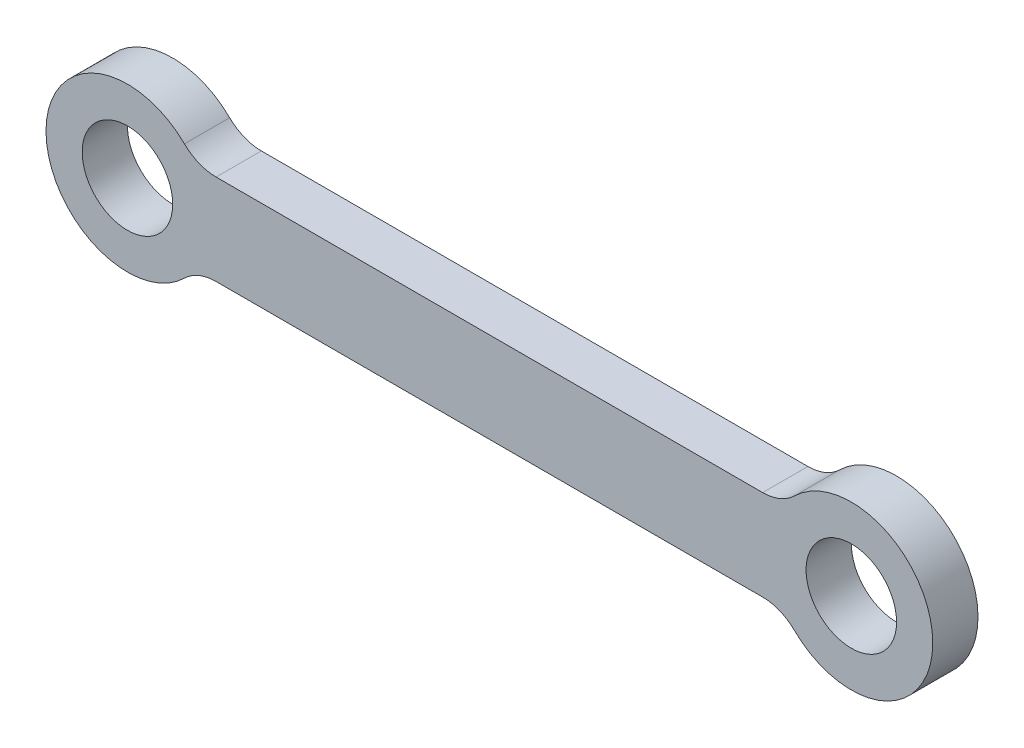
ISO-10303-21;
HEADER;
FILE_DESCRIPTION(('STEP AP214'),'2;1');
FILE_NAME('part.step','',(''),(''),'','','');
FILE_SCHEMA(('AUTOMOTIVE_DESIGN { 1 0 10303 214 1 1 1 1 }'));
ENDSEC;
DATA;
#1=APPLICATION_CONTEXT('core data for automotive mechanical design processes');
#2=APPLICATION_PROTOCOL_DEFINITION('international standard','automotive_design',2000,#1);
#3=PRODUCT_CONTEXT('',#1,'mechanical');
#4=PRODUCT('Part','Part','',(#3));
#5=PRODUCT_RELATED_PRODUCT_CATEGORY('part','',(#4));
#6=PRODUCT_DEFINITION_FORMATION('','',#4);
#7=PRODUCT_DEFINITION_CONTEXT('part definition',#1,'design');
#8=PRODUCT_DEFINITION('design','',#6,#7);
#9=PRODUCT_DEFINITION_SHAPE('','',#8);
#10=(LENGTH_UNIT() NAMED_UNIT(*) SI_UNIT(.MILLI.,.METRE.));
#11=(NAMED_UNIT(*) PLANE_ANGLE_UNIT() SI_UNIT($,.RADIAN.));
#12=(NAMED_UNIT(*) SI_UNIT($,.STERADIAN.) SOLID_ANGLE_UNIT());
#13=UNCERTAINTY_MEASURE_WITH_UNIT(LENGTH_MEASURE(1.E-05),#10,'distance_accuracy_value','');
#14=(GEOMETRIC_REPRESENTATION_CONTEXT(3) GLOBAL_UNCERTAINTY_ASSIGNED_CONTEXT((#13)) GLOBAL_UNIT_ASSIGNED_CONTEXT((#10,
#11,#12)) REPRESENTATION_CONTEXT('',''));
#15=CARTESIAN_POINT('',(0.,0.,0.));
#16=DIRECTION('',(0.,0.,1.));
#17=DIRECTION('',(1.,0.,0.));
#18=AXIS2_PLACEMENT_3D('',#15,#16,#17);
#19=CARTESIAN_POINT('',(70.2020410288673,10.,5.));
#20=DIRECTION('',(0.,0.,1.));
#21=DIRECTION('',(1.,0.,0.));
#22=AXIS2_PLACEMENT_3D('',#19,#20,#21);
#23=PLANE('',#22);
#24=CARTESIAN_POINT('',(0.,0.,5.));
#25=DIRECTION('',(0.,0.,1.));
#26=DIRECTION('',(1.,0.,0.));
#27=AXIS2_PLACEMENT_3D('',#24,#25,#26);
#28=CIRCLE('',#27,5.);
#29=CARTESIAN_POINT('',(5.,0.,5.));
#30=VERTEX_POINT('',#29);
#31=EDGE_CURVE('E134',#30,#30,#28,.T.);
#32=ORIENTED_EDGE('',*,*,#31,.F.);
#33=EDGE_LOOP('',(#32));
#34=FACE_BOUND('',#33,.T.);
#35=CARTESIAN_POINT('',(70.2020410288673,10.,5.));
#36=DIRECTION('',(0.,0.,-1.));
#37=DIRECTION('',(1.,0.,0.));
#38=AXIS2_PLACEMENT_3D('',#35,#36,#37);
#39=CIRCLE('',#38,5.);
#40=CARTESIAN_POINT('',(73.7013120899861,6.42857142857143,5.));
#41=VERTEX_POINT('',#40);
#42=CARTESIAN_POINT('',(70.2020410288673,5.,5.));
#43=VERTEX_POINT('',#42);
#44=EDGE_CURVE('E145',#41,#43,#39,.T.);
#45=ORIENTED_EDGE('',*,*,#44,.T.);
#46=DIRECTION('',(-1.,0.,0.));
#47=VECTOR('',#46,1.);
#48=CARTESIAN_POINT('',(9.79795897113271,5.,5.));
#49=LINE('',#48,#47);
#50=CARTESIAN_POINT('',(9.79795897113271,5.,5.));
#51=VERTEX_POINT('',#50);
#52=EDGE_CURVE('E93',#43,#51,#49,.T.);
#53=ORIENTED_EDGE('',*,*,#52,.T.);
#54=CARTESIAN_POINT('',(9.79795897113271,10.,5.));
#55=DIRECTION('',(0.,0.,-1.));
#56=DIRECTION('',(-1.,0.,0.));
#57=AXIS2_PLACEMENT_3D('',#54,#55,#56);
#58=CIRCLE('',#57,5.);
#59=CARTESIAN_POINT('',(6.29868791001389,6.42857142857143,5.));
#60=VERTEX_POINT('',#59);
#61=EDGE_CURVE('E160',#51,#60,#58,.T.);
#62=ORIENTED_EDGE('',*,*,#61,.T.);
#63=CARTESIAN_POINT('',(0.,0.,5.));
#64=DIRECTION('',(0.,0.,1.));
#65=DIRECTION('',(1.,0.,0.));
#66=AXIS2_PLACEMENT_3D('',#63,#64,#65);
#67=CIRCLE('',#66,9.);
#68=CARTESIAN_POINT('',(6.29868791001388,-6.42857142857143,5.));
#69=VERTEX_POINT('',#68);
#70=EDGE_CURVE('E173',#60,#69,#67,.T.);
#71=ORIENTED_EDGE('',*,*,#70,.T.);
#72=CARTESIAN_POINT('',(9.79795897113271,-10.,5.));
#73=DIRECTION('',(0.,0.,-1.));
#74=DIRECTION('',(1.,0.,0.));
#75=AXIS2_PLACEMENT_3D('',#72,#73,#74);
#76=CIRCLE('',#75,5.);
#77=CARTESIAN_POINT('',(9.79795897113271,-5.,5.));
#78=VERTEX_POINT('',#77);
#79=EDGE_CURVE('E112',#69,#78,#76,.T.);
#80=ORIENTED_EDGE('',*,*,#79,.T.);
#81=DIRECTION('',(1.,0.,0.));
#82=VECTOR('',#81,1.);
#83=CARTESIAN_POINT('',(9.79795897113271,-5.,5.));
#84=LINE('',#83,#82);
#85=CARTESIAN_POINT('',(70.2020410288673,-5.,5.));
#86=VERTEX_POINT('',#85);
#87=EDGE_CURVE('E106',#78,#86,#84,.T.);
#88=ORIENTED_EDGE('',*,*,#87,.T.);
#89=CARTESIAN_POINT('',(70.2020410288673,-10.,5.));
#90=DIRECTION('',(0.,0.,-1.));
#91=DIRECTION('',(-1.,0.,0.));
#92=AXIS2_PLACEMENT_3D('',#89,#90,#91);
#93=CIRCLE('',#92,5.);
#94=CARTESIAN_POINT('',(73.7013120899861,-6.42857142857143,5.));
#95=VERTEX_POINT('',#94);
#96=EDGE_CURVE('E110',#86,#95,#93,.T.);
#97=ORIENTED_EDGE('',*,*,#96,.T.);
#98=CARTESIAN_POINT('',(80.,0.,5.));
#99=DIRECTION('',(0.,0.,1.));
#100=DIRECTION('',(1.,0.,0.));
#101=AXIS2_PLACEMENT_3D('',#98,#99,#100);
#102=CIRCLE('',#101,9.);
#103=EDGE_CURVE('E50',#95,#41,#102,.T.);
#104=ORIENTED_EDGE('',*,*,#103,.T.);
#105=EDGE_LOOP('',(#45,#53,#62,#71,#80,#88,#97,#104));
#106=FACE_BOUND('',#105,.T.);
#107=CARTESIAN_POINT('',(80.,0.,5.));
#108=DIRECTION('',(0.,0.,1.));
#109=DIRECTION('',(1.,0.,0.));
#110=AXIS2_PLACEMENT_3D('',#107,#108,#109);
#111=CIRCLE('',#110,4.99999999999999);
#112=CARTESIAN_POINT('',(85.,0.,5.));
#113=VERTEX_POINT('',#112);
#114=EDGE_CURVE('E182',#113,#113,#111,.T.);
#115=ORIENTED_EDGE('',*,*,#114,.F.);
#116=EDGE_LOOP('',(#115));
#117=FACE_BOUND('',#116,.T.);
#118=ADVANCED_FACE('F33',(#34,#106,#117),#23,.T.);
#119=CARTESIAN_POINT('',(70.2020410288673,10.,0.));
#120=DIRECTION('',(0.,0.,1.));
#121=DIRECTION('',(1.,0.,0.));
#122=AXIS2_PLACEMENT_3D('',#119,#120,#121);
#123=PLANE('',#122);
#124=CARTESIAN_POINT('',(70.2020410288673,10.,0.));
#125=DIRECTION('',(0.,0.,-1.));
#126=DIRECTION('',(1.,0.,0.));
#127=AXIS2_PLACEMENT_3D('',#124,#125,#126);
#128=CIRCLE('',#127,5.);
#129=CARTESIAN_POINT('',(73.7013120899861,6.42857142857143,0.));
#130=VERTEX_POINT('',#129);
#131=CARTESIAN_POINT('',(70.2020410288673,5.,0.));
#132=VERTEX_POINT('',#131);
#133=EDGE_CURVE('E130',#130,#132,#128,.T.);
#134=ORIENTED_EDGE('',*,*,#133,.F.);
#135=CARTESIAN_POINT('',(80.,0.,0.));
#136=DIRECTION('',(0.,0.,1.));
#137=DIRECTION('',(1.,0.,0.));
#138=AXIS2_PLACEMENT_3D('',#135,#136,#137);
#139=CIRCLE('',#138,9.);
#140=CARTESIAN_POINT('',(73.7013120899861,-6.42857142857143,0.));
#141=VERTEX_POINT('',#140);
#142=EDGE_CURVE('E85',#141,#130,#139,.T.);
#143=ORIENTED_EDGE('',*,*,#142,.F.);
#144=CARTESIAN_POINT('',(70.2020410288673,-10.,0.));
#145=DIRECTION('',(0.,0.,-1.));
#146=DIRECTION('',(-1.,0.,0.));
#147=AXIS2_PLACEMENT_3D('',#144,#145,#146);
#148=CIRCLE('',#147,5.);
#149=CARTESIAN_POINT('',(70.2020410288673,-5.,0.));
#150=VERTEX_POINT('',#149);
#151=EDGE_CURVE('E79',#150,#141,#148,.T.);
#152=ORIENTED_EDGE('',*,*,#151,.F.);
#153=DIRECTION('',(1.,0.,0.));
#154=VECTOR('',#153,1.);
#155=CARTESIAN_POINT('',(9.79795897113271,-5.,0.));
#156=LINE('',#155,#154);
#157=CARTESIAN_POINT('',(9.79795897113271,-5.,0.));
#158=VERTEX_POINT('',#157);
#159=EDGE_CURVE('E120',#158,#150,#156,.T.);
#160=ORIENTED_EDGE('',*,*,#159,.F.);
#161=CARTESIAN_POINT('',(9.79795897113271,-10.,0.));
#162=DIRECTION('',(0.,0.,-1.));
#163=DIRECTION('',(1.,0.,0.));
#164=AXIS2_PLACEMENT_3D('',#161,#162,#163);
#165=CIRCLE('',#164,5.);
#166=CARTESIAN_POINT('',(6.29868791001388,-6.42857142857143,0.));
#167=VERTEX_POINT('',#166);
#168=EDGE_CURVE('E140',#167,#158,#165,.T.);
#169=ORIENTED_EDGE('',*,*,#168,.F.);
#170=CARTESIAN_POINT('',(0.,0.,0.));
#171=DIRECTION('',(0.,0.,1.));
#172=DIRECTION('',(1.,0.,0.));
#173=AXIS2_PLACEMENT_3D('',#170,#171,#172);
#174=CIRCLE('',#173,9.);
#175=CARTESIAN_POINT('',(6.29868791001389,6.42857142857143,0.));
#176=VERTEX_POINT('',#175);
#177=EDGE_CURVE('E138',#176,#167,#174,.T.);
#178=ORIENTED_EDGE('',*,*,#177,.F.);
#179=CARTESIAN_POINT('',(9.79795897113271,10.,0.));
#180=DIRECTION('',(0.,0.,-1.));
#181=DIRECTION('',(-1.,0.,0.));
#182=AXIS2_PLACEMENT_3D('',#179,#180,#181);
#183=CIRCLE('',#182,5.);
#184=CARTESIAN_POINT('',(9.79795897113271,5.,0.));
#185=VERTEX_POINT('',#184);
#186=EDGE_CURVE('E136',#185,#176,#183,.T.);
#187=ORIENTED_EDGE('',*,*,#186,.F.);
#188=DIRECTION('',(-1.,0.,0.));
#189=VECTOR('',#188,1.);
#190=CARTESIAN_POINT('',(9.79795897113271,5.,0.));
#191=LINE('',#190,#189);
#192=EDGE_CURVE('E133',#132,#185,#191,.T.);
#193=ORIENTED_EDGE('',*,*,#192,.F.);
#194=EDGE_LOOP('',(#134,#143,#152,#160,#169,#178,#187,#193));
#195=FACE_BOUND('',#194,.T.);
#196=CARTESIAN_POINT('',(0.,0.,0.));
#197=DIRECTION('',(0.,0.,1.));
#198=DIRECTION('',(1.,0.,0.));
#199=AXIS2_PLACEMENT_3D('',#196,#197,#198);
#200=CIRCLE('',#199,5.);
#201=CARTESIAN_POINT('',(5.,0.,0.));
#202=VERTEX_POINT('',#201);
#203=EDGE_CURVE('E179',#202,#202,#200,.T.);
#204=ORIENTED_EDGE('',*,*,#203,.T.);
#205=EDGE_LOOP('',(#204));
#206=FACE_BOUND('',#205,.T.);
#207=CARTESIAN_POINT('',(80.,0.,0.));
#208=DIRECTION('',(0.,0.,1.));
#209=DIRECTION('',(1.,0.,0.));
#210=AXIS2_PLACEMENT_3D('',#207,#208,#209);
#211=CIRCLE('',#210,4.99999999999999);
#212=CARTESIAN_POINT('',(85.,0.,0.));
#213=VERTEX_POINT('',#212);
#214=EDGE_CURVE('E185',#213,#213,#211,.T.);
#215=ORIENTED_EDGE('',*,*,#214,.T.);
#216=EDGE_LOOP('',(#215));
#217=FACE_BOUND('',#216,.T.);
#218=ADVANCED_FACE('F164',(#195,#206,#217),#123,.F.);
#219=CARTESIAN_POINT('',(70.2020410288673,10.,5.));
#220=DIRECTION('',(0.,0.,-1.));
#221=DIRECTION('',(-1.,0.,0.));
#222=AXIS2_PLACEMENT_3D('',#219,#220,#221);
#223=CYLINDRICAL_SURFACE('',#222,5.);
#224=ORIENTED_EDGE('',*,*,#133,.T.);
#225=DIRECTION('',(0.,0.,-1.));
#226=VECTOR('',#225,1.);
#227=CARTESIAN_POINT('',(70.2020410288673,5.,5.));
#228=LINE('',#227,#226);
#229=EDGE_CURVE('E11',#43,#132,#228,.T.);
#230=ORIENTED_EDGE('',*,*,#229,.F.);
#231=ORIENTED_EDGE('',*,*,#44,.F.);
#232=DIRECTION('',(0.,0.,-1.));
#233=VECTOR('',#232,1.);
#234=CARTESIAN_POINT('',(73.7013120899861,6.42857142857143,5.));
#235=LINE('',#234,#233);
#236=EDGE_CURVE('E126',#41,#130,#235,.T.);
#237=ORIENTED_EDGE('',*,*,#236,.T.);
#238=EDGE_LOOP('',(#224,#230,#231,#237));
#239=FACE_BOUND('',#238,.T.);
#240=ADVANCED_FACE('F35',(#239),#223,.F.);
#241=CARTESIAN_POINT('',(9.79795897113271,5.,5.));
#242=DIRECTION('',(0.,-1.,0.));
#243=DIRECTION('',(0.,0.,-1.));
#244=AXIS2_PLACEMENT_3D('',#241,#242,#243);
#245=PLANE('',#244);
#246=ORIENTED_EDGE('',*,*,#192,.T.);
#247=DIRECTION('',(0.,0.,-1.));
#248=VECTOR('',#247,1.);
#249=CARTESIAN_POINT('',(9.79795897113271,5.,5.));
#250=LINE('',#249,#248);
#251=EDGE_CURVE('E42',#51,#185,#250,.T.);
#252=ORIENTED_EDGE('',*,*,#251,.F.);
#253=ORIENTED_EDGE('',*,*,#52,.F.);
#254=ORIENTED_EDGE('',*,*,#229,.T.);
#255=EDGE_LOOP('',(#246,#252,#253,#254));
#256=FACE_BOUND('',#255,.T.);
#257=ADVANCED_FACE('F217',(#256),#245,.F.);
#258=CARTESIAN_POINT('',(9.79795897113271,10.,5.));
#259=DIRECTION('',(0.,0.,-1.));
#260=DIRECTION('',(-1.,0.,0.));
#261=AXIS2_PLACEMENT_3D('',#258,#259,#260);
#262=CYLINDRICAL_SURFACE('',#261,5.);
#263=ORIENTED_EDGE('',*,*,#186,.T.);
#264=DIRECTION('',(0.,0.,-1.));
#265=VECTOR('',#264,1.);
#266=CARTESIAN_POINT('',(6.29868791001389,6.42857142857143,5.));
#267=LINE('',#266,#265);
#268=EDGE_CURVE('E152',#60,#176,#267,.T.);
#269=ORIENTED_EDGE('',*,*,#268,.F.);
#270=ORIENTED_EDGE('',*,*,#61,.F.);
#271=ORIENTED_EDGE('',*,*,#251,.T.);
#272=EDGE_LOOP('',(#263,#269,#270,#271));
#273=FACE_BOUND('',#272,.T.);
#274=ADVANCED_FACE('F158',(#273),#262,.F.);
#275=CARTESIAN_POINT('',(0.,0.,5.));
#276=DIRECTION('',(0.,0.,-1.));
#277=DIRECTION('',(-1.,0.,0.));
#278=AXIS2_PLACEMENT_3D('',#275,#276,#277);
#279=CYLINDRICAL_SURFACE('',#278,9.);
#280=ORIENTED_EDGE('',*,*,#177,.T.);
#281=DIRECTION('',(0.,0.,-1.));
#282=VECTOR('',#281,1.);
#283=CARTESIAN_POINT('',(6.29868791001388,-6.42857142857143,5.));
#284=LINE('',#283,#282);
#285=EDGE_CURVE('E149',#69,#167,#284,.T.);
#286=ORIENTED_EDGE('',*,*,#285,.F.);
#287=ORIENTED_EDGE('',*,*,#70,.F.);
#288=ORIENTED_EDGE('',*,*,#268,.T.);
#289=EDGE_LOOP('',(#280,#286,#287,#288));
#290=FACE_BOUND('',#289,.T.);
#291=ADVANCED_FACE('F169',(#290),#279,.T.);
#292=CARTESIAN_POINT('',(9.79795897113271,-10.,5.));
#293=DIRECTION('',(0.,0.,-1.));
#294=DIRECTION('',(-1.,0.,0.));
#295=AXIS2_PLACEMENT_3D('',#292,#293,#294);
#296=CYLINDRICAL_SURFACE('',#295,5.);
#297=ORIENTED_EDGE('',*,*,#168,.T.);
#298=DIRECTION('',(0.,0.,-1.));
#299=VECTOR('',#298,1.);
#300=CARTESIAN_POINT('',(9.79795897113271,-5.,5.));
#301=LINE('',#300,#299);
#302=EDGE_CURVE('E121',#78,#158,#301,.T.);
#303=ORIENTED_EDGE('',*,*,#302,.F.);
#304=ORIENTED_EDGE('',*,*,#79,.F.);
#305=ORIENTED_EDGE('',*,*,#285,.T.);
#306=EDGE_LOOP('',(#297,#303,#304,#305));
#307=FACE_BOUND('',#306,.T.);
#308=ADVANCED_FACE('F172',(#307),#296,.F.);
#309=CARTESIAN_POINT('',(9.79795897113271,-5.,5.));
#310=DIRECTION('',(0.,1.,0.));
#311=DIRECTION('',(0.,0.,1.));
#312=AXIS2_PLACEMENT_3D('',#309,#310,#311);
#313=PLANE('',#312);
#314=ORIENTED_EDGE('',*,*,#159,.T.);
#315=DIRECTION('',(0.,0.,-1.));
#316=VECTOR('',#315,1.);
#317=CARTESIAN_POINT('',(70.2020410288673,-5.,5.));
#318=LINE('',#317,#316);
#319=EDGE_CURVE('E117',#86,#150,#318,.T.);
#320=ORIENTED_EDGE('',*,*,#319,.F.);
#321=ORIENTED_EDGE('',*,*,#87,.F.);
#322=ORIENTED_EDGE('',*,*,#302,.T.);
#323=EDGE_LOOP('',(#314,#320,#321,#322));
#324=FACE_BOUND('',#323,.T.);
#325=ADVANCED_FACE('F118',(#324),#313,.F.);
#326=CARTESIAN_POINT('',(70.2020410288673,-10.,5.));
#327=DIRECTION('',(0.,0.,-1.));
#328=DIRECTION('',(-1.,0.,0.));
#329=AXIS2_PLACEMENT_3D('',#326,#327,#328);
#330=CYLINDRICAL_SURFACE('',#329,5.);
#331=ORIENTED_EDGE('',*,*,#151,.T.);
#332=DIRECTION('',(0.,0.,-1.));
#333=VECTOR('',#332,1.);
#334=CARTESIAN_POINT('',(73.7013120899861,-6.42857142857143,5.));
#335=LINE('',#334,#333);
#336=EDGE_CURVE('E122',#95,#141,#335,.T.);
#337=ORIENTED_EDGE('',*,*,#336,.F.);
#338=ORIENTED_EDGE('',*,*,#96,.F.);
#339=ORIENTED_EDGE('',*,*,#319,.T.);
#340=EDGE_LOOP('',(#331,#337,#338,#339));
#341=FACE_BOUND('',#340,.T.);
#342=ADVANCED_FACE('F124',(#341),#330,.F.);
#343=CARTESIAN_POINT('',(80.,0.,5.));
#344=DIRECTION('',(0.,0.,-1.));
#345=DIRECTION('',(-1.,0.,0.));
#346=AXIS2_PLACEMENT_3D('',#343,#344,#345);
#347=CYLINDRICAL_SURFACE('',#346,9.);
#348=ORIENTED_EDGE('',*,*,#142,.T.);
#349=ORIENTED_EDGE('',*,*,#236,.F.);
#350=ORIENTED_EDGE('',*,*,#103,.F.);
#351=ORIENTED_EDGE('',*,*,#336,.T.);
#352=EDGE_LOOP('',(#348,#349,#350,#351));
#353=FACE_BOUND('',#352,.T.);
#354=ADVANCED_FACE('F205',(#353),#347,.T.);
#355=CARTESIAN_POINT('',(0.,0.,5.));
#356=DIRECTION('',(0.,0.,-1.));
#357=DIRECTION('',(-1.,0.,0.));
#358=AXIS2_PLACEMENT_3D('',#355,#356,#357);
#359=CYLINDRICAL_SURFACE('',#358,5.);
#360=ORIENTED_EDGE('',*,*,#31,.T.);
#361=EDGE_LOOP('',(#360));
#362=FACE_BOUND('',#361,.T.);
#363=ORIENTED_EDGE('',*,*,#203,.F.);
#364=EDGE_LOOP('',(#363));
#365=FACE_BOUND('',#364,.T.);
#366=ADVANCED_FACE('F202',(#362,#365),#359,.F.);
#367=CARTESIAN_POINT('',(80.,0.,5.));
#368=DIRECTION('',(0.,0.,-1.));
#369=DIRECTION('',(-1.,0.,0.));
#370=AXIS2_PLACEMENT_3D('',#367,#368,#369);
#371=CYLINDRICAL_SURFACE('',#370,4.99999999999999);
#372=ORIENTED_EDGE('',*,*,#114,.T.);
#373=EDGE_LOOP('',(#372));
#374=FACE_BOUND('',#373,.T.);
#375=ORIENTED_EDGE('',*,*,#214,.F.);
#376=EDGE_LOOP('',(#375));
#377=FACE_BOUND('',#376,.T.);
#378=ADVANCED_FACE('F191',(#374,#377),#371,.F.);
#379=CLOSED_SHELL('',(#118,#218,#240,#257,#274,#291,#308,#325,#342,#354,#366,#378));
#380=MANIFOLD_SOLID_BREP('B2',#379);
#381=ADVANCED_BREP_SHAPE_REPRESENTATION('',(#18,#380),#14);
#382=SHAPE_DEFINITION_REPRESENTATION(#9,#381);
ENDSEC;
END-ISO-10303-21;
